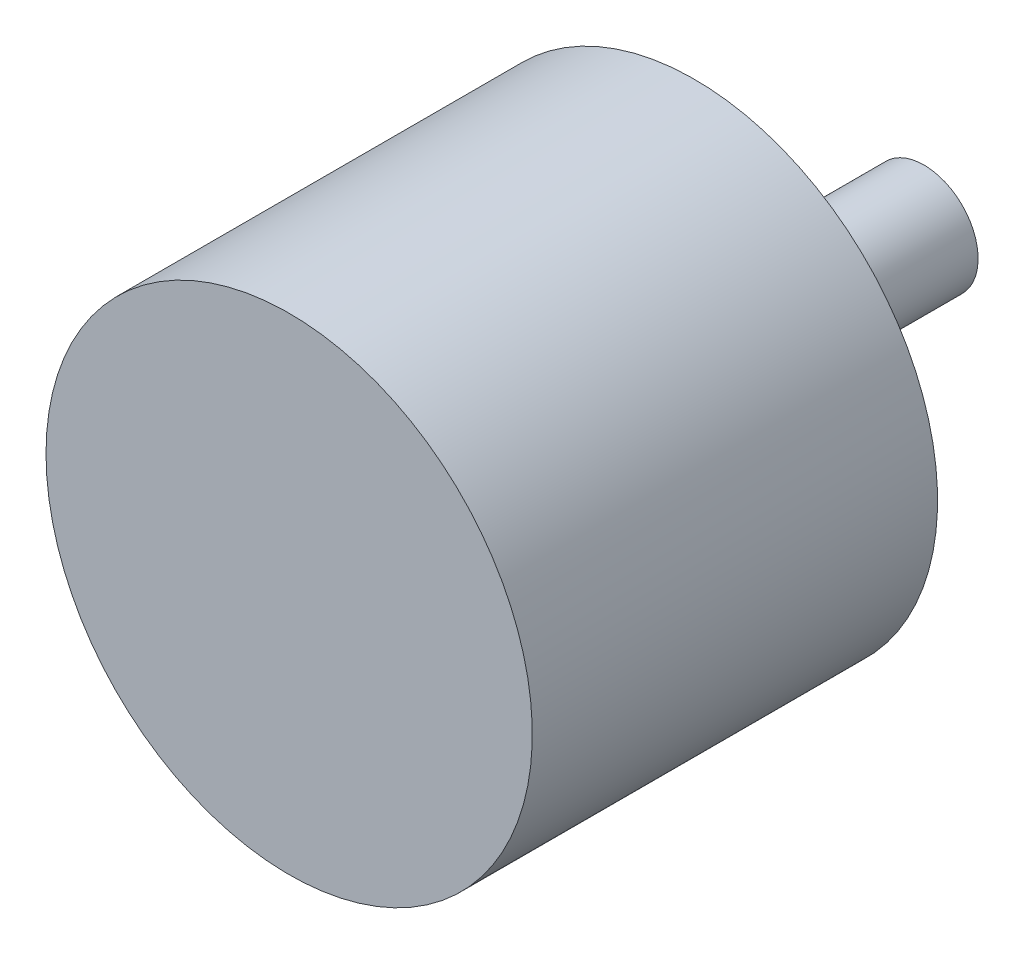
ISO-10303-21;
HEADER;
FILE_DESCRIPTION(('STEP AP214'),'2;1');
FILE_NAME('part.step','',(''),(''),'','','');
FILE_SCHEMA(('AUTOMOTIVE_DESIGN { 1 0 10303 214 1 1 1 1 }'));
ENDSEC;
DATA;
#1=APPLICATION_CONTEXT('core data for automotive mechanical design processes');
#2=APPLICATION_PROTOCOL_DEFINITION('international standard','automotive_design',2000,#1);
#3=PRODUCT_CONTEXT('',#1,'mechanical');
#4=PRODUCT('Part','Part','',(#3));
#5=PRODUCT_RELATED_PRODUCT_CATEGORY('part','',(#4));
#6=PRODUCT_DEFINITION_FORMATION('','',#4);
#7=PRODUCT_DEFINITION_CONTEXT('part definition',#1,'design');
#8=PRODUCT_DEFINITION('design','',#6,#7);
#9=PRODUCT_DEFINITION_SHAPE('','',#8);
#10=(LENGTH_UNIT() NAMED_UNIT(*) SI_UNIT(.MILLI.,.METRE.));
#11=(NAMED_UNIT(*) PLANE_ANGLE_UNIT() SI_UNIT($,.RADIAN.));
#12=(NAMED_UNIT(*) SI_UNIT($,.STERADIAN.) SOLID_ANGLE_UNIT());
#13=UNCERTAINTY_MEASURE_WITH_UNIT(LENGTH_MEASURE(1.E-05),#10,'distance_accuracy_value','');
#14=(GEOMETRIC_REPRESENTATION_CONTEXT(3) GLOBAL_UNCERTAINTY_ASSIGNED_CONTEXT((#13)) GLOBAL_UNIT_ASSIGNED_CONTEXT((#10,
#11,#12)) REPRESENTATION_CONTEXT('',''));
#15=CARTESIAN_POINT('',(0.,0.,0.));
#16=DIRECTION('',(0.,0.,1.));
#17=DIRECTION('',(1.,0.,0.));
#18=AXIS2_PLACEMENT_3D('',#15,#16,#17);
#19=CARTESIAN_POINT('',(0.,0.,30.));
#20=DIRECTION('',(0.,0.,-1.));
#21=DIRECTION('',(-1.,0.,0.));
#22=AXIS2_PLACEMENT_3D('',#19,#20,#21);
#23=CYLINDRICAL_SURFACE('',#22,18.);
#24=CARTESIAN_POINT('',(0.,0.,30.));
#25=DIRECTION('',(0.,0.,-1.));
#26=DIRECTION('',(-1.,0.,0.));
#27=AXIS2_PLACEMENT_3D('',#24,#25,#26);
#28=CIRCLE('',#27,18.);
#29=CARTESIAN_POINT('',(-18.,0.,30.));
#30=VERTEX_POINT('',#29);
#31=EDGE_CURVE('E10',#30,#30,#28,.T.);
#32=ORIENTED_EDGE('',*,*,#31,.T.);
#33=EDGE_LOOP('',(#32));
#34=FACE_BOUND('',#33,.T.);
#35=CARTESIAN_POINT('',(0.,0.,0.));
#36=DIRECTION('',(0.,0.,-1.));
#37=DIRECTION('',(-1.,0.,0.));
#38=AXIS2_PLACEMENT_3D('',#35,#36,#37);
#39=CIRCLE('',#38,18.);
#40=CARTESIAN_POINT('',(-18.,0.,0.));
#41=VERTEX_POINT('',#40);
#42=EDGE_CURVE('E45',#41,#41,#39,.T.);
#43=ORIENTED_EDGE('',*,*,#42,.F.);
#44=EDGE_LOOP('',(#43));
#45=FACE_BOUND('',#44,.T.);
#46=ADVANCED_FACE('F31',(#34,#45),#23,.T.);
#47=CARTESIAN_POINT('',(18.,0.,30.));
#48=DIRECTION('',(0.,0.,1.));
#49=DIRECTION('',(1.,0.,0.));
#50=AXIS2_PLACEMENT_3D('',#47,#48,#49);
#51=PLANE('',#50);
#52=ORIENTED_EDGE('',*,*,#31,.F.);
#53=EDGE_LOOP('',(#52));
#54=FACE_BOUND('',#53,.T.);
#55=ADVANCED_FACE('F100',(#54),#51,.T.);
#56=CARTESIAN_POINT('',(0.,0.,-17.));
#57=DIRECTION('',(0.,0.,-1.));
#58=DIRECTION('',(-1.,0.,0.));
#59=AXIS2_PLACEMENT_3D('',#56,#57,#58);
#60=PLANE('',#59);
#61=CARTESIAN_POINT('',(0.,0.,-17.));
#62=DIRECTION('',(0.,0.,-1.));
#63=DIRECTION('',(-1.,0.,0.));
#64=AXIS2_PLACEMENT_3D('',#61,#62,#63);
#65=CIRCLE('',#64,4.);
#66=CARTESIAN_POINT('',(-4.,0.,-17.));
#67=VERTEX_POINT('',#66);
#68=EDGE_CURVE('E37',#67,#67,#65,.T.);
#69=ORIENTED_EDGE('',*,*,#68,.T.);
#70=EDGE_LOOP('',(#69));
#71=FACE_BOUND('',#70,.T.);
#72=ADVANCED_FACE('F95',(#71),#60,.T.);
#73=CARTESIAN_POINT('',(0.,0.,30.));
#74=DIRECTION('',(0.,0.,-1.));
#75=DIRECTION('',(-1.,0.,0.));
#76=AXIS2_PLACEMENT_3D('',#73,#74,#75);
#77=CYLINDRICAL_SURFACE('',#76,4.);
#78=CARTESIAN_POINT('',(0.,0.,0.));
#79=DIRECTION('',(0.,0.,-1.));
#80=DIRECTION('',(-1.,0.,0.));
#81=AXIS2_PLACEMENT_3D('',#78,#79,#80);
#82=CIRCLE('',#81,4.);
#83=CARTESIAN_POINT('',(-4.,0.,0.));
#84=VERTEX_POINT('',#83);
#85=EDGE_CURVE('E41',#84,#84,#82,.T.);
#86=ORIENTED_EDGE('',*,*,#85,.T.);
#87=EDGE_LOOP('',(#86));
#88=FACE_BOUND('',#87,.T.);
#89=ORIENTED_EDGE('',*,*,#68,.F.);
#90=EDGE_LOOP('',(#89));
#91=FACE_BOUND('',#90,.T.);
#92=ADVANCED_FACE('F81',(#88,#91),#77,.T.);
#93=CARTESIAN_POINT('',(4.,0.,0.));
#94=DIRECTION('',(0.,0.,-1.));
#95=DIRECTION('',(-1.,0.,0.));
#96=AXIS2_PLACEMENT_3D('',#93,#94,#95);
#97=PLANE('',#96);
#98=CARTESIAN_POINT('',(-9.89949493661167,9.89949493661166,0.));
#99=DIRECTION('',(0.,0.,-1.));
#100=DIRECTION('',(-1.,0.,0.));
#101=AXIS2_PLACEMENT_3D('',#98,#99,#100);
#102=CIRCLE('',#101,1.74999999999999);
#103=CARTESIAN_POINT('',(-11.6494949366117,9.89949493661166,0.));
#104=VERTEX_POINT('',#103);
#105=EDGE_CURVE('E71',#104,#104,#102,.T.);
#106=ORIENTED_EDGE('',*,*,#105,.F.);
#107=EDGE_LOOP('',(#106));
#108=FACE_BOUND('',#107,.T.);
#109=CARTESIAN_POINT('',(9.89949493661167,-9.89949493661166,0.));
#110=DIRECTION('',(0.,0.,-1.));
#111=DIRECTION('',(-1.,0.,0.));
#112=AXIS2_PLACEMENT_3D('',#109,#110,#111);
#113=CIRCLE('',#112,1.74999999999999);
#114=CARTESIAN_POINT('',(8.14949493661168,-9.89949493661166,0.));
#115=VERTEX_POINT('',#114);
#116=EDGE_CURVE('E65',#115,#115,#113,.T.);
#117=ORIENTED_EDGE('',*,*,#116,.F.);
#118=EDGE_LOOP('',(#117));
#119=FACE_BOUND('',#118,.T.);
#120=CARTESIAN_POINT('',(-9.89949493661165,-9.89949493661168,0.));
#121=DIRECTION('',(0.,0.,-1.));
#122=DIRECTION('',(-1.,0.,0.));
#123=AXIS2_PLACEMENT_3D('',#120,#121,#122);
#124=CIRCLE('',#123,1.74999999999999);
#125=CARTESIAN_POINT('',(-11.6494949366116,-9.89949493661168,0.));
#126=VERTEX_POINT('',#125);
#127=EDGE_CURVE('E59',#126,#126,#124,.T.);
#128=ORIENTED_EDGE('',*,*,#127,.F.);
#129=EDGE_LOOP('',(#128));
#130=FACE_BOUND('',#129,.T.);
#131=CARTESIAN_POINT('',(9.89949493661166,9.89949493661167,0.));
#132=DIRECTION('',(0.,0.,-1.));
#133=DIRECTION('',(-1.,0.,0.));
#134=AXIS2_PLACEMENT_3D('',#131,#132,#133);
#135=CIRCLE('',#134,1.74999999999999);
#136=CARTESIAN_POINT('',(8.14949493661167,9.89949493661167,0.));
#137=VERTEX_POINT('',#136);
#138=EDGE_CURVE('E53',#137,#137,#135,.T.);
#139=ORIENTED_EDGE('',*,*,#138,.F.);
#140=EDGE_LOOP('',(#139));
#141=FACE_BOUND('',#140,.T.);
#142=ORIENTED_EDGE('',*,*,#42,.T.);
#143=EDGE_LOOP('',(#142));
#144=FACE_BOUND('',#143,.T.);
#145=ORIENTED_EDGE('',*,*,#85,.F.);
#146=EDGE_LOOP('',(#145));
#147=FACE_BOUND('',#146,.T.);
#148=ADVANCED_FACE('F77',(#108,#119,#130,#141,#144,#147),#97,.T.);
#149=CARTESIAN_POINT('',(9.89949493661166,9.89949493661167,5.));
#150=DIRECTION('',(0.,0.,1.));
#151=DIRECTION('',(1.,0.,0.));
#152=AXIS2_PLACEMENT_3D('',#149,#150,#151);
#153=PLANE('',#152);
#154=CARTESIAN_POINT('',(9.89949493661166,9.89949493661167,5.));
#155=DIRECTION('',(0.,0.,-1.));
#156=DIRECTION('',(-1.,0.,0.));
#157=AXIS2_PLACEMENT_3D('',#154,#155,#156);
#158=CIRCLE('',#157,1.74999999999999);
#159=CARTESIAN_POINT('',(8.14949493661167,9.89949493661167,5.));
#160=VERTEX_POINT('',#159);
#161=EDGE_CURVE('E50',#160,#160,#158,.T.);
#162=ORIENTED_EDGE('',*,*,#161,.T.);
#163=EDGE_LOOP('',(#162));
#164=FACE_BOUND('',#163,.T.);
#165=ADVANCED_FACE('F80',(#164),#153,.F.);
#166=CARTESIAN_POINT('',(9.89949493661166,9.89949493661167,0.));
#167=DIRECTION('',(0.,0.,-1.));
#168=DIRECTION('',(-1.,0.,0.));
#169=AXIS2_PLACEMENT_3D('',#166,#167,#168);
#170=CYLINDRICAL_SURFACE('',#169,1.74999999999999);
#171=ORIENTED_EDGE('',*,*,#161,.F.);
#172=EDGE_LOOP('',(#171));
#173=FACE_BOUND('',#172,.T.);
#174=ORIENTED_EDGE('',*,*,#138,.T.);
#175=EDGE_LOOP('',(#174));
#176=FACE_BOUND('',#175,.T.);
#177=ADVANCED_FACE('F133',(#173,#176),#170,.F.);
#178=CARTESIAN_POINT('',(-9.89949493661165,-9.89949493661168,5.));
#179=DIRECTION('',(0.,0.,1.));
#180=DIRECTION('',(1.,0.,0.));
#181=AXIS2_PLACEMENT_3D('',#178,#179,#180);
#182=PLANE('',#181);
#183=CARTESIAN_POINT('',(-9.89949493661165,-9.89949493661168,5.));
#184=DIRECTION('',(0.,0.,-1.));
#185=DIRECTION('',(-1.,0.,0.));
#186=AXIS2_PLACEMENT_3D('',#183,#184,#185);
#187=CIRCLE('',#186,1.74999999999999);
#188=CARTESIAN_POINT('',(-11.6494949366116,-9.89949493661168,5.));
#189=VERTEX_POINT('',#188);
#190=EDGE_CURVE('E56',#189,#189,#187,.T.);
#191=ORIENTED_EDGE('',*,*,#190,.T.);
#192=EDGE_LOOP('',(#191));
#193=FACE_BOUND('',#192,.T.);
#194=ADVANCED_FACE('F143',(#193),#182,.F.);
#195=CARTESIAN_POINT('',(-9.89949493661165,-9.89949493661168,0.));
#196=DIRECTION('',(0.,0.,-1.));
#197=DIRECTION('',(-1.,0.,0.));
#198=AXIS2_PLACEMENT_3D('',#195,#196,#197);
#199=CYLINDRICAL_SURFACE('',#198,1.74999999999999);
#200=ORIENTED_EDGE('',*,*,#190,.F.);
#201=EDGE_LOOP('',(#200));
#202=FACE_BOUND('',#201,.T.);
#203=ORIENTED_EDGE('',*,*,#127,.T.);
#204=EDGE_LOOP('',(#203));
#205=FACE_BOUND('',#204,.T.);
#206=ADVANCED_FACE('F153',(#202,#205),#199,.F.);
#207=CARTESIAN_POINT('',(9.89949493661167,-9.89949493661166,5.));
#208=DIRECTION('',(0.,0.,1.));
#209=DIRECTION('',(1.,0.,0.));
#210=AXIS2_PLACEMENT_3D('',#207,#208,#209);
#211=PLANE('',#210);
#212=CARTESIAN_POINT('',(9.89949493661167,-9.89949493661166,5.));
#213=DIRECTION('',(0.,0.,-1.));
#214=DIRECTION('',(-1.,0.,0.));
#215=AXIS2_PLACEMENT_3D('',#212,#213,#214);
#216=CIRCLE('',#215,1.74999999999999);
#217=CARTESIAN_POINT('',(8.14949493661168,-9.89949493661166,5.));
#218=VERTEX_POINT('',#217);
#219=EDGE_CURVE('E62',#218,#218,#216,.T.);
#220=ORIENTED_EDGE('',*,*,#219,.T.);
#221=EDGE_LOOP('',(#220));
#222=FACE_BOUND('',#221,.T.);
#223=ADVANCED_FACE('F163',(#222),#211,.F.);
#224=CARTESIAN_POINT('',(9.89949493661167,-9.89949493661166,0.));
#225=DIRECTION('',(0.,0.,-1.));
#226=DIRECTION('',(-1.,0.,0.));
#227=AXIS2_PLACEMENT_3D('',#224,#225,#226);
#228=CYLINDRICAL_SURFACE('',#227,1.74999999999999);
#229=ORIENTED_EDGE('',*,*,#219,.F.);
#230=EDGE_LOOP('',(#229));
#231=FACE_BOUND('',#230,.T.);
#232=ORIENTED_EDGE('',*,*,#116,.T.);
#233=EDGE_LOOP('',(#232));
#234=FACE_BOUND('',#233,.T.);
#235=ADVANCED_FACE('F173',(#231,#234),#228,.F.);
#236=CARTESIAN_POINT('',(-9.89949493661167,9.89949493661166,5.));
#237=DIRECTION('',(0.,0.,1.));
#238=DIRECTION('',(1.,0.,0.));
#239=AXIS2_PLACEMENT_3D('',#236,#237,#238);
#240=PLANE('',#239);
#241=CARTESIAN_POINT('',(-9.89949493661167,9.89949493661166,5.));
#242=DIRECTION('',(0.,0.,-1.));
#243=DIRECTION('',(-1.,0.,0.));
#244=AXIS2_PLACEMENT_3D('',#241,#242,#243);
#245=CIRCLE('',#244,1.74999999999999);
#246=CARTESIAN_POINT('',(-11.6494949366117,9.89949493661166,5.));
#247=VERTEX_POINT('',#246);
#248=EDGE_CURVE('E68',#247,#247,#245,.T.);
#249=ORIENTED_EDGE('',*,*,#248,.T.);
#250=EDGE_LOOP('',(#249));
#251=FACE_BOUND('',#250,.T.);
#252=ADVANCED_FACE('F183',(#251),#240,.F.);
#253=CARTESIAN_POINT('',(-9.89949493661167,9.89949493661166,0.));
#254=DIRECTION('',(0.,0.,-1.));
#255=DIRECTION('',(-1.,0.,0.));
#256=AXIS2_PLACEMENT_3D('',#253,#254,#255);
#257=CYLINDRICAL_SURFACE('',#256,1.74999999999999);
#258=ORIENTED_EDGE('',*,*,#248,.F.);
#259=EDGE_LOOP('',(#258));
#260=FACE_BOUND('',#259,.T.);
#261=ORIENTED_EDGE('',*,*,#105,.T.);
#262=EDGE_LOOP('',(#261));
#263=FACE_BOUND('',#262,.T.);
#264=ADVANCED_FACE('F75',(#260,#263),#257,.F.);
#265=CLOSED_SHELL('',(#46,#55,#72,#92,#148,#165,#177,#194,#206,#223,#235,#252,#264));
#266=MANIFOLD_SOLID_BREP('B2',#265);
#267=ADVANCED_BREP_SHAPE_REPRESENTATION('',(#18,#266),#14);
#268=SHAPE_DEFINITION_REPRESENTATION(#9,#267);
ENDSEC;
END-ISO-10303-21;
